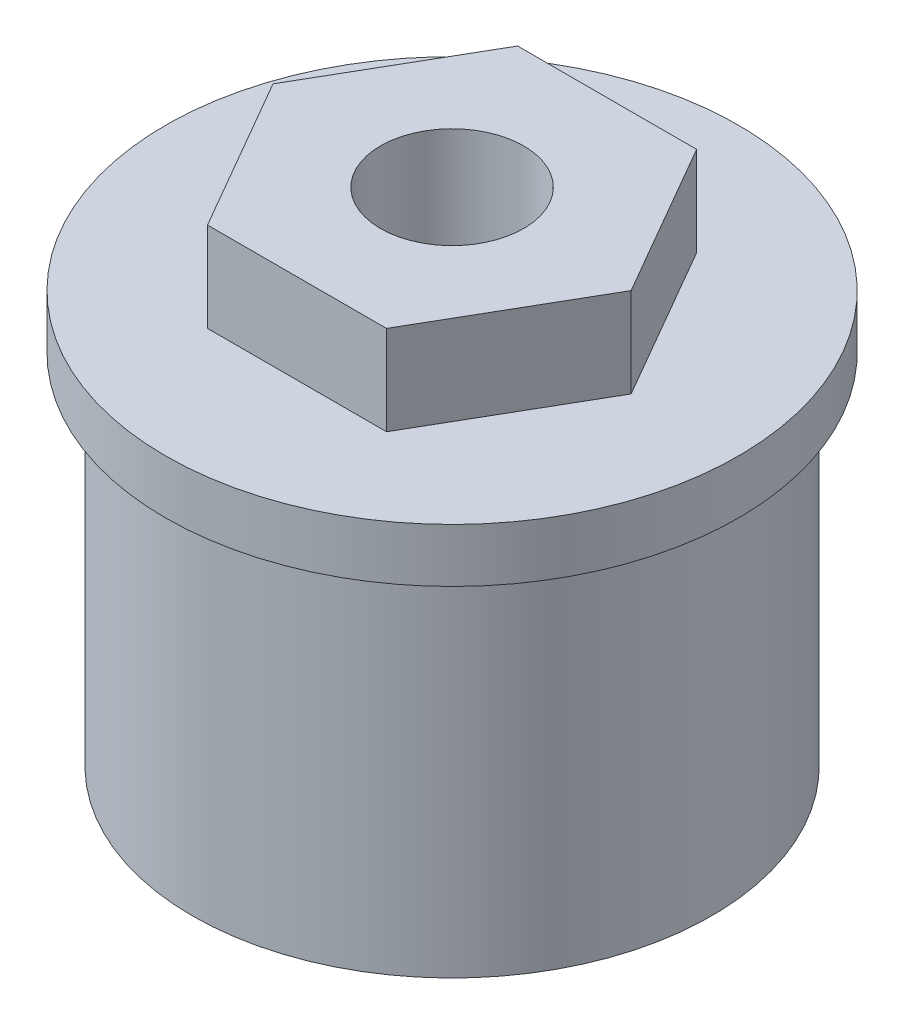
ISO-10303-21;
HEADER;
FILE_DESCRIPTION(('STEP AP214'),'2;1');
FILE_NAME('part.step','',(''),(''),'','','');
FILE_SCHEMA(('AUTOMOTIVE_DESIGN { 1 0 10303 214 1 1 1 1 }'));
ENDSEC;
DATA;
#1=APPLICATION_CONTEXT('core data for automotive mechanical design processes');
#2=APPLICATION_PROTOCOL_DEFINITION('international standard','automotive_design',2000,#1);
#3=PRODUCT_CONTEXT('',#1,'mechanical');
#4=PRODUCT('Part','Part','',(#3));
#5=PRODUCT_RELATED_PRODUCT_CATEGORY('part','',(#4));
#6=PRODUCT_DEFINITION_FORMATION('','',#4);
#7=PRODUCT_DEFINITION_CONTEXT('part definition',#1,'design');
#8=PRODUCT_DEFINITION('design','',#6,#7);
#9=PRODUCT_DEFINITION_SHAPE('','',#8);
#10=(LENGTH_UNIT() NAMED_UNIT(*) SI_UNIT(.MILLI.,.METRE.));
#11=(NAMED_UNIT(*) PLANE_ANGLE_UNIT() SI_UNIT($,.RADIAN.));
#12=(NAMED_UNIT(*) SI_UNIT($,.STERADIAN.) SOLID_ANGLE_UNIT());
#13=UNCERTAINTY_MEASURE_WITH_UNIT(LENGTH_MEASURE(1.E-05),#10,'distance_accuracy_value','');
#14=(GEOMETRIC_REPRESENTATION_CONTEXT(3) GLOBAL_UNCERTAINTY_ASSIGNED_CONTEXT((#13)) GLOBAL_UNIT_ASSIGNED_CONTEXT((#10,
#11,#12)) REPRESENTATION_CONTEXT('',''));
#15=CARTESIAN_POINT('',(0.,0.,0.));
#16=DIRECTION('',(0.,0.,1.));
#17=DIRECTION('',(1.,0.,0.));
#18=AXIS2_PLACEMENT_3D('',#15,#16,#17);
#19=CARTESIAN_POINT('',(0.,23.,0.));
#20=DIRECTION('',(0.,1.,0.));
#21=DIRECTION('',(0.,0.,1.));
#22=AXIS2_PLACEMENT_3D('',#19,#20,#21);
#23=PLANE('',#22);
#24=CARTESIAN_POINT('',(0.,23.,0.));
#25=DIRECTION('',(0.,1.,0.));
#26=DIRECTION('',(0.,0.,1.));
#27=AXIS2_PLACEMENT_3D('',#24,#25,#26);
#28=CIRCLE('',#27,16.);
#29=CARTESIAN_POINT('',(0.,23.,16.));
#30=VERTEX_POINT('',#29);
#31=EDGE_CURVE('E138',#30,#30,#28,.T.);
#32=ORIENTED_EDGE('',*,*,#31,.T.);
#33=EDGE_LOOP('',(#32));
#34=FACE_BOUND('',#33,.T.);
#35=DIRECTION('',(-0.5,0.,-0.866025403784439));
#36=VECTOR('',#35,1.);
#37=CARTESIAN_POINT('',(10.,23.,0.));
#38=LINE('',#37,#36);
#39=CARTESIAN_POINT('',(10.,23.,0.));
#40=VERTEX_POINT('',#39);
#41=CARTESIAN_POINT('',(5.,23.,-8.66025403784438));
#42=VERTEX_POINT('',#41);
#43=EDGE_CURVE('E119',#40,#42,#38,.T.);
#44=ORIENTED_EDGE('',*,*,#43,.F.);
#45=DIRECTION('',(0.5,0.,-0.866025403784439));
#46=VECTOR('',#45,1.);
#47=CARTESIAN_POINT('',(5.,23.,8.66025403784439));
#48=LINE('',#47,#46);
#49=CARTESIAN_POINT('',(5.,23.,8.66025403784439));
#50=VERTEX_POINT('',#49);
#51=EDGE_CURVE('E116',#50,#40,#48,.T.);
#52=ORIENTED_EDGE('',*,*,#51,.F.);
#53=DIRECTION('',(1.,0.,0.));
#54=VECTOR('',#53,1.);
#55=CARTESIAN_POINT('',(-5.,23.,8.66025403784438));
#56=LINE('',#55,#54);
#57=CARTESIAN_POINT('',(-5.,23.,8.66025403784438));
#58=VERTEX_POINT('',#57);
#59=EDGE_CURVE('E75',#58,#50,#56,.T.);
#60=ORIENTED_EDGE('',*,*,#59,.F.);
#61=DIRECTION('',(0.5,0.,0.866025403784439));
#62=VECTOR('',#61,1.);
#63=CARTESIAN_POINT('',(-10.,23.,0.));
#64=LINE('',#63,#62);
#65=CARTESIAN_POINT('',(-10.,23.,0.));
#66=VERTEX_POINT('',#65);
#67=EDGE_CURVE('E125',#66,#58,#64,.T.);
#68=ORIENTED_EDGE('',*,*,#67,.F.);
#69=DIRECTION('',(-0.5,0.,0.866025403784439));
#70=VECTOR('',#69,1.);
#71=CARTESIAN_POINT('',(-5.,23.,-8.66025403784439));
#72=LINE('',#71,#70);
#73=CARTESIAN_POINT('',(-5.,23.,-8.66025403784439));
#74=VERTEX_POINT('',#73);
#75=EDGE_CURVE('E105',#74,#66,#72,.T.);
#76=ORIENTED_EDGE('',*,*,#75,.F.);
#77=DIRECTION('',(-1.,0.,0.));
#78=VECTOR('',#77,1.);
#79=CARTESIAN_POINT('',(5.,23.,-8.66025403784438));
#80=LINE('',#79,#78);
#81=EDGE_CURVE('E122',#42,#74,#80,.T.);
#82=ORIENTED_EDGE('',*,*,#81,.F.);
#83=EDGE_LOOP('',(#44,#52,#60,#68,#76,#82));
#84=FACE_BOUND('',#83,.T.);
#85=ADVANCED_FACE('F32',(#34,#84),#23,.T.);
#86=CARTESIAN_POINT('',(0.,20.,0.));
#87=DIRECTION('',(0.,-1.,0.));
#88=DIRECTION('',(0.,0.,-1.));
#89=AXIS2_PLACEMENT_3D('',#86,#87,#88);
#90=CYLINDRICAL_SURFACE('',#89,14.5);
#91=CARTESIAN_POINT('',(0.,20.,0.));
#92=DIRECTION('',(0.,1.,0.));
#93=DIRECTION('',(0.,0.,1.));
#94=AXIS2_PLACEMENT_3D('',#91,#92,#93);
#95=CIRCLE('',#94,14.5);
#96=CARTESIAN_POINT('',(0.,20.,14.5));
#97=VERTEX_POINT('',#96);
#98=EDGE_CURVE('E11',#97,#97,#95,.T.);
#99=ORIENTED_EDGE('',*,*,#98,.F.);
#100=EDGE_LOOP('',(#99));
#101=FACE_BOUND('',#100,.T.);
#102=CARTESIAN_POINT('',(0.,0.,0.));
#103=DIRECTION('',(0.,1.,0.));
#104=DIRECTION('',(0.,0.,1.));
#105=AXIS2_PLACEMENT_3D('',#102,#103,#104);
#106=CIRCLE('',#105,14.5);
#107=CARTESIAN_POINT('',(0.,0.,14.5));
#108=VERTEX_POINT('',#107);
#109=EDGE_CURVE('E36',#108,#108,#106,.T.);
#110=ORIENTED_EDGE('',*,*,#109,.T.);
#111=EDGE_LOOP('',(#110));
#112=FACE_BOUND('',#111,.T.);
#113=ADVANCED_FACE('F34',(#101,#112),#90,.T.);
#114=CARTESIAN_POINT('',(0.,0.,0.));
#115=DIRECTION('',(0.,1.,0.));
#116=DIRECTION('',(0.,0.,1.));
#117=AXIS2_PLACEMENT_3D('',#114,#115,#116);
#118=PLANE('',#117);
#119=CARTESIAN_POINT('',(0.,0.,0.));
#120=DIRECTION('',(0.,1.,0.));
#121=DIRECTION('',(0.,0.,1.));
#122=AXIS2_PLACEMENT_3D('',#119,#120,#121);
#123=CIRCLE('',#122,4.);
#124=CARTESIAN_POINT('',(0.,0.,4.));
#125=VERTEX_POINT('',#124);
#126=EDGE_CURVE('E120',#125,#125,#123,.T.);
#127=ORIENTED_EDGE('',*,*,#126,.T.);
#128=EDGE_LOOP('',(#127));
#129=FACE_BOUND('',#128,.T.);
#130=ORIENTED_EDGE('',*,*,#109,.F.);
#131=EDGE_LOOP('',(#130));
#132=FACE_BOUND('',#131,.T.);
#133=ADVANCED_FACE('F158',(#129,#132),#118,.F.);
#134=CARTESIAN_POINT('',(0.,23.,0.));
#135=DIRECTION('',(0.,-1.,0.));
#136=DIRECTION('',(0.,0.,-1.));
#137=AXIS2_PLACEMENT_3D('',#134,#135,#136);
#138=CYLINDRICAL_SURFACE('',#137,16.);
#139=ORIENTED_EDGE('',*,*,#31,.F.);
#140=EDGE_LOOP('',(#139));
#141=FACE_BOUND('',#140,.T.);
#142=CARTESIAN_POINT('',(0.,20.,0.));
#143=DIRECTION('',(0.,1.,0.));
#144=DIRECTION('',(0.,0.,1.));
#145=AXIS2_PLACEMENT_3D('',#142,#143,#144);
#146=CIRCLE('',#145,16.);
#147=CARTESIAN_POINT('',(0.,20.,16.));
#148=VERTEX_POINT('',#147);
#149=EDGE_CURVE('E137',#148,#148,#146,.T.);
#150=ORIENTED_EDGE('',*,*,#149,.T.);
#151=EDGE_LOOP('',(#150));
#152=FACE_BOUND('',#151,.T.);
#153=ADVANCED_FACE('F144',(#141,#152),#138,.T.);
#154=CARTESIAN_POINT('',(0.,20.,0.));
#155=DIRECTION('',(0.,1.,0.));
#156=DIRECTION('',(0.,0.,1.));
#157=AXIS2_PLACEMENT_3D('',#154,#155,#156);
#158=PLANE('',#157);
#159=ORIENTED_EDGE('',*,*,#98,.T.);
#160=EDGE_LOOP('',(#159));
#161=FACE_BOUND('',#160,.T.);
#162=ORIENTED_EDGE('',*,*,#149,.F.);
#163=EDGE_LOOP('',(#162));
#164=FACE_BOUND('',#163,.T.);
#165=ADVANCED_FACE('F146',(#161,#164),#158,.F.);
#166=CARTESIAN_POINT('',(5.,28.,8.66025403784439));
#167=DIRECTION('',(-0.866025403784439,0.,-0.5));
#168=DIRECTION('',(-0.5,0.,0.866025403784439));
#169=AXIS2_PLACEMENT_3D('',#166,#167,#168);
#170=PLANE('',#169);
#171=ORIENTED_EDGE('',*,*,#51,.T.);
#172=DIRECTION('',(0.,-1.,0.));
#173=VECTOR('',#172,1.);
#174=CARTESIAN_POINT('',(10.,28.,0.));
#175=LINE('',#174,#173);
#176=CARTESIAN_POINT('',(10.,28.,0.));
#177=VERTEX_POINT('',#176);
#178=EDGE_CURVE('E135',#177,#40,#175,.T.);
#179=ORIENTED_EDGE('',*,*,#178,.F.);
#180=DIRECTION('',(0.5,0.,-0.866025403784439));
#181=VECTOR('',#180,1.);
#182=CARTESIAN_POINT('',(5.,28.,8.66025403784439));
#183=LINE('',#182,#181);
#184=CARTESIAN_POINT('',(5.,28.,8.66025403784439));
#185=VERTEX_POINT('',#184);
#186=EDGE_CURVE('E128',#185,#177,#183,.T.);
#187=ORIENTED_EDGE('',*,*,#186,.F.);
#188=DIRECTION('',(0.,-1.,0.));
#189=VECTOR('',#188,1.);
#190=CARTESIAN_POINT('',(5.,28.,8.66025403784439));
#191=LINE('',#190,#189);
#192=EDGE_CURVE('E112',#185,#50,#191,.T.);
#193=ORIENTED_EDGE('',*,*,#192,.T.);
#194=EDGE_LOOP('',(#171,#179,#187,#193));
#195=FACE_BOUND('',#194,.T.);
#196=ADVANCED_FACE('F148',(#195),#170,.F.);
#197=CARTESIAN_POINT('',(10.,28.,0.));
#198=DIRECTION('',(-0.866025403784439,0.,0.5));
#199=DIRECTION('',(0.5,0.,0.866025403784439));
#200=AXIS2_PLACEMENT_3D('',#197,#198,#199);
#201=PLANE('',#200);
#202=ORIENTED_EDGE('',*,*,#43,.T.);
#203=DIRECTION('',(0.,-1.,0.));
#204=VECTOR('',#203,1.);
#205=CARTESIAN_POINT('',(5.,28.,-8.66025403784438));
#206=LINE('',#205,#204);
#207=CARTESIAN_POINT('',(5.,28.,-8.66025403784438));
#208=VERTEX_POINT('',#207);
#209=EDGE_CURVE('E132',#208,#42,#206,.T.);
#210=ORIENTED_EDGE('',*,*,#209,.F.);
#211=DIRECTION('',(-0.5,0.,-0.866025403784439));
#212=VECTOR('',#211,1.);
#213=CARTESIAN_POINT('',(10.,28.,0.));
#214=LINE('',#213,#212);
#215=EDGE_CURVE('E83',#177,#208,#214,.T.);
#216=ORIENTED_EDGE('',*,*,#215,.F.);
#217=ORIENTED_EDGE('',*,*,#178,.T.);
#218=EDGE_LOOP('',(#202,#210,#216,#217));
#219=FACE_BOUND('',#218,.T.);
#220=ADVANCED_FACE('F155',(#219),#201,.F.);
#221=CARTESIAN_POINT('',(5.,28.,-8.66025403784438));
#222=DIRECTION('',(0.,0.,1.));
#223=DIRECTION('',(1.,0.,0.));
#224=AXIS2_PLACEMENT_3D('',#221,#222,#223);
#225=PLANE('',#224);
#226=ORIENTED_EDGE('',*,*,#81,.T.);
#227=DIRECTION('',(0.,-1.,0.));
#228=VECTOR('',#227,1.);
#229=CARTESIAN_POINT('',(-5.,28.,-8.66025403784439));
#230=LINE('',#229,#228);
#231=CARTESIAN_POINT('',(-5.,28.,-8.66025403784439));
#232=VERTEX_POINT('',#231);
#233=EDGE_CURVE('E108',#232,#74,#230,.T.);
#234=ORIENTED_EDGE('',*,*,#233,.F.);
#235=DIRECTION('',(-1.,0.,0.));
#236=VECTOR('',#235,1.);
#237=CARTESIAN_POINT('',(5.,28.,-8.66025403784438));
#238=LINE('',#237,#236);
#239=EDGE_CURVE('E96',#208,#232,#238,.T.);
#240=ORIENTED_EDGE('',*,*,#239,.F.);
#241=ORIENTED_EDGE('',*,*,#209,.T.);
#242=EDGE_LOOP('',(#226,#234,#240,#241));
#243=FACE_BOUND('',#242,.T.);
#244=ADVANCED_FACE('F172',(#243),#225,.F.);
#245=CARTESIAN_POINT('',(-5.,28.,-8.66025403784439));
#246=DIRECTION('',(0.866025403784439,0.,0.5));
#247=DIRECTION('',(0.5,0.,-0.866025403784439));
#248=AXIS2_PLACEMENT_3D('',#245,#246,#247);
#249=PLANE('',#248);
#250=ORIENTED_EDGE('',*,*,#75,.T.);
#251=DIRECTION('',(0.,-1.,0.));
#252=VECTOR('',#251,1.);
#253=CARTESIAN_POINT('',(-10.,28.,0.));
#254=LINE('',#253,#252);
#255=CARTESIAN_POINT('',(-10.,28.,0.));
#256=VERTEX_POINT('',#255);
#257=EDGE_CURVE('E102',#256,#66,#254,.T.);
#258=ORIENTED_EDGE('',*,*,#257,.F.);
#259=DIRECTION('',(-0.5,0.,0.866025403784439));
#260=VECTOR('',#259,1.);
#261=CARTESIAN_POINT('',(-5.,28.,-8.66025403784439));
#262=LINE('',#261,#260);
#263=EDGE_CURVE('E90',#232,#256,#262,.T.);
#264=ORIENTED_EDGE('',*,*,#263,.F.);
#265=ORIENTED_EDGE('',*,*,#233,.T.);
#266=EDGE_LOOP('',(#250,#258,#264,#265));
#267=FACE_BOUND('',#266,.T.);
#268=ADVANCED_FACE('F103',(#267),#249,.F.);
#269=CARTESIAN_POINT('',(-10.,28.,0.));
#270=DIRECTION('',(0.866025403784439,0.,-0.5));
#271=DIRECTION('',(-0.5,0.,-0.866025403784439));
#272=AXIS2_PLACEMENT_3D('',#269,#270,#271);
#273=PLANE('',#272);
#274=ORIENTED_EDGE('',*,*,#67,.T.);
#275=DIRECTION('',(0.,-1.,0.));
#276=VECTOR('',#275,1.);
#277=CARTESIAN_POINT('',(-5.,28.,8.66025403784438));
#278=LINE('',#277,#276);
#279=CARTESIAN_POINT('',(-5.,28.,8.66025403784438));
#280=VERTEX_POINT('',#279);
#281=EDGE_CURVE('E47',#280,#58,#278,.T.);
#282=ORIENTED_EDGE('',*,*,#281,.F.);
#283=DIRECTION('',(0.5,0.,0.866025403784439));
#284=VECTOR('',#283,1.);
#285=CARTESIAN_POINT('',(-10.,28.,0.));
#286=LINE('',#285,#284);
#287=EDGE_CURVE('E94',#256,#280,#286,.T.);
#288=ORIENTED_EDGE('',*,*,#287,.F.);
#289=ORIENTED_EDGE('',*,*,#257,.T.);
#290=EDGE_LOOP('',(#274,#282,#288,#289));
#291=FACE_BOUND('',#290,.T.);
#292=ADVANCED_FACE('F110',(#291),#273,.F.);
#293=CARTESIAN_POINT('',(-5.,28.,8.66025403784438));
#294=DIRECTION('',(0.,0.,-1.));
#295=DIRECTION('',(-1.,0.,0.));
#296=AXIS2_PLACEMENT_3D('',#293,#294,#295);
#297=PLANE('',#296);
#298=ORIENTED_EDGE('',*,*,#59,.T.);
#299=ORIENTED_EDGE('',*,*,#192,.F.);
#300=DIRECTION('',(1.,0.,0.));
#301=VECTOR('',#300,1.);
#302=CARTESIAN_POINT('',(-5.,28.,8.66025403784438));
#303=LINE('',#302,#301);
#304=EDGE_CURVE('E55',#280,#185,#303,.T.);
#305=ORIENTED_EDGE('',*,*,#304,.F.);
#306=ORIENTED_EDGE('',*,*,#281,.T.);
#307=EDGE_LOOP('',(#298,#299,#305,#306));
#308=FACE_BOUND('',#307,.T.);
#309=ADVANCED_FACE('F180',(#308),#297,.F.);
#310=CARTESIAN_POINT('',(0.,28.,0.));
#311=DIRECTION('',(0.,1.,0.));
#312=DIRECTION('',(0.,0.,1.));
#313=AXIS2_PLACEMENT_3D('',#310,#311,#312);
#314=PLANE('',#313);
#315=CARTESIAN_POINT('',(0.,28.,0.));
#316=DIRECTION('',(0.,1.,0.));
#317=DIRECTION('',(0.,0.,1.));
#318=AXIS2_PLACEMENT_3D('',#315,#316,#317);
#319=CIRCLE('',#318,4.);
#320=CARTESIAN_POINT('',(0.,28.,4.));
#321=VERTEX_POINT('',#320);
#322=EDGE_CURVE('E194',#321,#321,#319,.T.);
#323=ORIENTED_EDGE('',*,*,#322,.F.);
#324=EDGE_LOOP('',(#323));
#325=FACE_BOUND('',#324,.T.);
#326=ORIENTED_EDGE('',*,*,#186,.T.);
#327=ORIENTED_EDGE('',*,*,#215,.T.);
#328=ORIENTED_EDGE('',*,*,#239,.T.);
#329=ORIENTED_EDGE('',*,*,#263,.T.);
#330=ORIENTED_EDGE('',*,*,#287,.T.);
#331=ORIENTED_EDGE('',*,*,#304,.T.);
#332=EDGE_LOOP('',(#326,#327,#328,#329,#330,#331));
#333=FACE_BOUND('',#332,.T.);
#334=ADVANCED_FACE('F92',(#325,#333),#314,.T.);
#335=CARTESIAN_POINT('',(0.,-2.00000000000002,0.));
#336=DIRECTION('',(0.,1.,0.));
#337=DIRECTION('',(0.,0.,1.));
#338=AXIS2_PLACEMENT_3D('',#335,#336,#337);
#339=CYLINDRICAL_SURFACE('',#338,4.);
#340=ORIENTED_EDGE('',*,*,#322,.T.);
#341=EDGE_LOOP('',(#340));
#342=FACE_BOUND('',#341,.T.);
#343=ORIENTED_EDGE('',*,*,#126,.F.);
#344=EDGE_LOOP('',(#343));
#345=FACE_BOUND('',#344,.T.);
#346=ADVANCED_FACE('F185',(#342,#345),#339,.F.);
#347=CLOSED_SHELL('',(#85,#113,#133,#153,#165,#196,#220,#244,#268,#292,#309,#334,#346));
#348=MANIFOLD_SOLID_BREP('B2',#347);
#349=ADVANCED_BREP_SHAPE_REPRESENTATION('',(#18,#348),#14);
#350=SHAPE_DEFINITION_REPRESENTATION(#9,#349);
ENDSEC;
END-ISO-10303-21;
